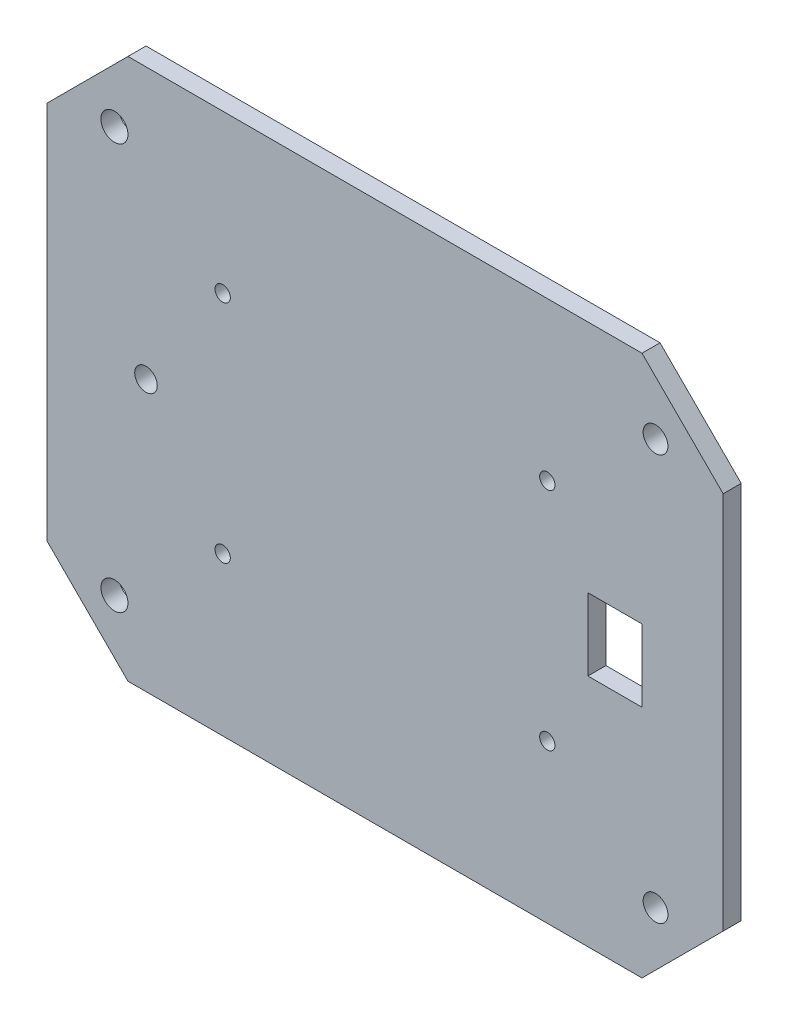
ISO-10303-21;
HEADER;
FILE_DESCRIPTION(('STEP AP214'),'2;1');
FILE_NAME('part.step','',(''),(''),'','','');
FILE_SCHEMA(('AUTOMOTIVE_DESIGN { 1 0 10303 214 1 1 1 1 }'));
ENDSEC;
DATA;
#1=APPLICATION_CONTEXT('core data for automotive mechanical design processes');
#2=APPLICATION_PROTOCOL_DEFINITION('international standard','automotive_design',2000,#1);
#3=PRODUCT_CONTEXT('',#1,'mechanical');
#4=PRODUCT('Part','Part','',(#3));
#5=PRODUCT_RELATED_PRODUCT_CATEGORY('part','',(#4));
#6=PRODUCT_DEFINITION_FORMATION('','',#4);
#7=PRODUCT_DEFINITION_CONTEXT('part definition',#1,'design');
#8=PRODUCT_DEFINITION('design','',#6,#7);
#9=PRODUCT_DEFINITION_SHAPE('','',#8);
#10=(LENGTH_UNIT() NAMED_UNIT(*) SI_UNIT(.MILLI.,.METRE.));
#11=(NAMED_UNIT(*) PLANE_ANGLE_UNIT() SI_UNIT($,.RADIAN.));
#12=(NAMED_UNIT(*) SI_UNIT($,.STERADIAN.) SOLID_ANGLE_UNIT());
#13=UNCERTAINTY_MEASURE_WITH_UNIT(LENGTH_MEASURE(1.E-05),#10,'distance_accuracy_value','');
#14=(GEOMETRIC_REPRESENTATION_CONTEXT(3) GLOBAL_UNCERTAINTY_ASSIGNED_CONTEXT((#13)) GLOBAL_UNIT_ASSIGNED_CONTEXT((#10,
#11,#12)) REPRESENTATION_CONTEXT('',''));
#15=CARTESIAN_POINT('',(0.,0.,0.));
#16=DIRECTION('',(0.,0.,1.));
#17=DIRECTION('',(1.,0.,0.));
#18=AXIS2_PLACEMENT_3D('',#15,#16,#17);
#19=CARTESIAN_POINT('',(0.,0.,4.));
#20=DIRECTION('',(0.,0.,1.));
#21=DIRECTION('',(1.,0.,0.));
#22=AXIS2_PLACEMENT_3D('',#19,#20,#21);
#23=PLANE('',#22);
#24=DIRECTION('',(1.,0.,0.));
#25=VECTOR('',#24,1.);
#26=CARTESIAN_POINT('',(45.,-8.,4.));
#27=LINE('',#26,#25);
#28=CARTESIAN_POINT('',(45.,-8.,4.));
#29=VERTEX_POINT('',#28);
#30=CARTESIAN_POINT('',(57.,-8.,4.));
#31=VERTEX_POINT('',#30);
#32=EDGE_CURVE('E138',#29,#31,#27,.T.);
#33=ORIENTED_EDGE('',*,*,#32,.F.);
#34=DIRECTION('',(0.,-1.,0.));
#35=VECTOR('',#34,1.);
#36=CARTESIAN_POINT('',(45.,-8.,4.));
#37=LINE('',#36,#35);
#38=CARTESIAN_POINT('',(45.,8.,4.));
#39=VERTEX_POINT('',#38);
#40=EDGE_CURVE('E130',#39,#29,#37,.T.);
#41=ORIENTED_EDGE('',*,*,#40,.F.);
#42=DIRECTION('',(-1.,0.,0.));
#43=VECTOR('',#42,1.);
#44=CARTESIAN_POINT('',(45.,8.,4.));
#45=LINE('',#44,#43);
#46=CARTESIAN_POINT('',(57.,8.,4.));
#47=VERTEX_POINT('',#46);
#48=EDGE_CURVE('E153',#47,#39,#45,.T.);
#49=ORIENTED_EDGE('',*,*,#48,.F.);
#50=DIRECTION('',(0.,1.,0.));
#51=VECTOR('',#50,1.);
#52=CARTESIAN_POINT('',(57.,-8.,4.));
#53=LINE('',#52,#51);
#54=EDGE_CURVE('E151',#31,#47,#53,.T.);
#55=ORIENTED_EDGE('',*,*,#54,.F.);
#56=EDGE_LOOP('',(#33,#41,#49,#55));
#57=FACE_BOUND('',#56,.T.);
#58=CARTESIAN_POINT('',(36.,25.,4.));
#59=DIRECTION('',(0.,0.,1.));
#60=DIRECTION('',(1.,0.,0.));
#61=AXIS2_PLACEMENT_3D('',#58,#59,#60);
#62=CIRCLE('',#61,1.7);
#63=CARTESIAN_POINT('',(37.7,25.,4.));
#64=VERTEX_POINT('',#63);
#65=EDGE_CURVE('E169',#64,#64,#62,.T.);
#66=ORIENTED_EDGE('',*,*,#65,.F.);
#67=EDGE_LOOP('',(#66));
#68=FACE_BOUND('',#67,.T.);
#69=CARTESIAN_POINT('',(-36.,25.,4.));
#70=DIRECTION('',(0.,0.,1.));
#71=DIRECTION('',(1.,0.,0.));
#72=AXIS2_PLACEMENT_3D('',#69,#70,#71);
#73=CIRCLE('',#72,1.7);
#74=CARTESIAN_POINT('',(-34.3,25.,4.));
#75=VERTEX_POINT('',#74);
#76=EDGE_CURVE('E181',#75,#75,#73,.T.);
#77=ORIENTED_EDGE('',*,*,#76,.F.);
#78=EDGE_LOOP('',(#77));
#79=FACE_BOUND('',#78,.T.);
#80=CARTESIAN_POINT('',(60.,45.,4.));
#81=DIRECTION('',(0.,0.,1.));
#82=DIRECTION('',(1.,0.,0.));
#83=AXIS2_PLACEMENT_3D('',#80,#81,#82);
#84=CIRCLE('',#83,2.75000000000001);
#85=CARTESIAN_POINT('',(62.75,45.,4.));
#86=VERTEX_POINT('',#85);
#87=EDGE_CURVE('E193',#86,#86,#84,.T.);
#88=ORIENTED_EDGE('',*,*,#87,.F.);
#89=EDGE_LOOP('',(#88));
#90=FACE_BOUND('',#89,.T.);
#91=CARTESIAN_POINT('',(-59.9999999999999,45.,4.));
#92=DIRECTION('',(0.,0.,1.));
#93=DIRECTION('',(1.,0.,0.));
#94=AXIS2_PLACEMENT_3D('',#91,#92,#93);
#95=CIRCLE('',#94,2.99999999999994);
#96=CARTESIAN_POINT('',(-57.,45.,4.));
#97=VERTEX_POINT('',#96);
#98=EDGE_CURVE('E205',#97,#97,#95,.T.);
#99=ORIENTED_EDGE('',*,*,#98,.F.);
#100=EDGE_LOOP('',(#99));
#101=FACE_BOUND('',#100,.T.);
#102=DIRECTION('',(0.707106781186544,-0.707106781186551,0.));
#103=VECTOR('',#102,1.);
#104=CARTESIAN_POINT('',(-74.9999999999999,-42.,4.));
#105=LINE('',#104,#103);
#106=CARTESIAN_POINT('',(-74.9999999999999,-42.,4.));
#107=VERTEX_POINT('',#106);
#108=CARTESIAN_POINT('',(-57.,-60.,4.));
#109=VERTEX_POINT('',#108);
#110=EDGE_CURVE('E217',#107,#109,#105,.T.);
#111=ORIENTED_EDGE('',*,*,#110,.T.);
#112=DIRECTION('',(1.,0.,0.));
#113=VECTOR('',#112,1.);
#114=CARTESIAN_POINT('',(-57.,-60.,4.));
#115=LINE('',#114,#113);
#116=CARTESIAN_POINT('',(57.,-60.,4.));
#117=VERTEX_POINT('',#116);
#118=EDGE_CURVE('E220',#109,#117,#115,.T.);
#119=ORIENTED_EDGE('',*,*,#118,.T.);
#120=DIRECTION('',(0.707106781186546,0.707106781186549,0.));
#121=VECTOR('',#120,1.);
#122=CARTESIAN_POINT('',(57.,-60.,4.));
#123=LINE('',#122,#121);
#124=CARTESIAN_POINT('',(75.,-42.,4.));
#125=VERTEX_POINT('',#124);
#126=EDGE_CURVE('E223',#117,#125,#123,.T.);
#127=ORIENTED_EDGE('',*,*,#126,.T.);
#128=DIRECTION('',(0.,1.,0.));
#129=VECTOR('',#128,1.);
#130=CARTESIAN_POINT('',(75.,-42.,4.));
#131=LINE('',#130,#129);
#132=CARTESIAN_POINT('',(75.,42.,4.));
#133=VERTEX_POINT('',#132);
#134=EDGE_CURVE('E225',#125,#133,#131,.T.);
#135=ORIENTED_EDGE('',*,*,#134,.T.);
#136=DIRECTION('',(-0.707106781186549,0.707106781186546,0.));
#137=VECTOR('',#136,1.);
#138=CARTESIAN_POINT('',(75.,42.,4.));
#139=LINE('',#138,#137);
#140=CARTESIAN_POINT('',(57.,59.9999999999999,4.));
#141=VERTEX_POINT('',#140);
#142=EDGE_CURVE('E227',#133,#141,#139,.T.);
#143=ORIENTED_EDGE('',*,*,#142,.T.);
#144=DIRECTION('',(-1.,0.,0.));
#145=VECTOR('',#144,1.);
#146=CARTESIAN_POINT('',(57.,59.9999999999999,4.));
#147=LINE('',#146,#145);
#148=CARTESIAN_POINT('',(-57.,59.9999999999999,4.));
#149=VERTEX_POINT('',#148);
#150=EDGE_CURVE('E229',#141,#149,#147,.T.);
#151=ORIENTED_EDGE('',*,*,#150,.T.);
#152=DIRECTION('',(-0.707106781186546,-0.707106781186548,0.));
#153=VECTOR('',#152,1.);
#154=CARTESIAN_POINT('',(-57.,59.9999999999999,4.));
#155=LINE('',#154,#153);
#156=CARTESIAN_POINT('',(-74.9999999999999,42.,4.));
#157=VERTEX_POINT('',#156);
#158=EDGE_CURVE('E231',#149,#157,#155,.T.);
#159=ORIENTED_EDGE('',*,*,#158,.T.);
#160=DIRECTION('',(0.,-1.,0.));
#161=VECTOR('',#160,1.);
#162=CARTESIAN_POINT('',(-74.9999999999999,42.,4.));
#163=LINE('',#162,#161);
#164=EDGE_CURVE('E233',#157,#107,#163,.T.);
#165=ORIENTED_EDGE('',*,*,#164,.T.);
#166=EDGE_LOOP('',(#111,#119,#127,#135,#143,#151,#159,#165));
#167=FACE_BOUND('',#166,.T.);
#168=CARTESIAN_POINT('',(-59.9999999999999,-45.0000000000001,4.));
#169=DIRECTION('',(0.,0.,1.));
#170=DIRECTION('',(1.,0.,0.));
#171=AXIS2_PLACEMENT_3D('',#168,#169,#170);
#172=CIRCLE('',#171,2.99999999999994);
#173=CARTESIAN_POINT('',(-57.,-45.0000000000001,4.));
#174=VERTEX_POINT('',#173);
#175=EDGE_CURVE('E211',#174,#174,#172,.T.);
#176=ORIENTED_EDGE('',*,*,#175,.F.);
#177=EDGE_LOOP('',(#176));
#178=FACE_BOUND('',#177,.T.);
#179=CARTESIAN_POINT('',(60.,-45.0000000000001,4.));
#180=DIRECTION('',(0.,0.,1.));
#181=DIRECTION('',(1.,0.,0.));
#182=AXIS2_PLACEMENT_3D('',#179,#180,#181);
#183=CIRCLE('',#182,2.75000000000001);
#184=CARTESIAN_POINT('',(62.75,-45.0000000000001,4.));
#185=VERTEX_POINT('',#184);
#186=EDGE_CURVE('E199',#185,#185,#183,.T.);
#187=ORIENTED_EDGE('',*,*,#186,.F.);
#188=EDGE_LOOP('',(#187));
#189=FACE_BOUND('',#188,.T.);
#190=CARTESIAN_POINT('',(-36.,-25.,4.));
#191=DIRECTION('',(0.,0.,1.));
#192=DIRECTION('',(1.,0.,0.));
#193=AXIS2_PLACEMENT_3D('',#190,#191,#192);
#194=CIRCLE('',#193,1.7);
#195=CARTESIAN_POINT('',(-34.3,-25.,4.));
#196=VERTEX_POINT('',#195);
#197=EDGE_CURVE('E187',#196,#196,#194,.T.);
#198=ORIENTED_EDGE('',*,*,#197,.F.);
#199=EDGE_LOOP('',(#198));
#200=FACE_BOUND('',#199,.T.);
#201=CARTESIAN_POINT('',(36.,-25.,4.));
#202=DIRECTION('',(0.,0.,1.));
#203=DIRECTION('',(1.,0.,0.));
#204=AXIS2_PLACEMENT_3D('',#201,#202,#203);
#205=CIRCLE('',#204,1.7);
#206=CARTESIAN_POINT('',(37.7,-25.,4.));
#207=VERTEX_POINT('',#206);
#208=EDGE_CURVE('E175',#207,#207,#205,.T.);
#209=ORIENTED_EDGE('',*,*,#208,.F.);
#210=EDGE_LOOP('',(#209));
#211=FACE_BOUND('',#210,.T.);
#212=CARTESIAN_POINT('',(-53.,0.,4.));
#213=DIRECTION('',(0.,0.,1.));
#214=DIRECTION('',(1.,0.,0.));
#215=AXIS2_PLACEMENT_3D('',#212,#213,#214);
#216=CIRCLE('',#215,2.5);
#217=CARTESIAN_POINT('',(-50.5,0.,4.));
#218=VERTEX_POINT('',#217);
#219=EDGE_CURVE('E159',#218,#218,#216,.T.);
#220=ORIENTED_EDGE('',*,*,#219,.F.);
#221=EDGE_LOOP('',(#220));
#222=FACE_BOUND('',#221,.T.);
#223=ADVANCED_FACE('F41',(#57,#68,#79,#90,#101,#167,#178,#189,#200,#211,#222),#23,.T.);
#224=CARTESIAN_POINT('',(0.,0.,0.));
#225=DIRECTION('',(0.,0.,1.));
#226=DIRECTION('',(1.,0.,0.));
#227=AXIS2_PLACEMENT_3D('',#224,#225,#226);
#228=PLANE('',#227);
#229=CARTESIAN_POINT('',(36.,25.,0.));
#230=DIRECTION('',(0.,0.,1.));
#231=DIRECTION('',(1.,0.,0.));
#232=AXIS2_PLACEMENT_3D('',#229,#230,#231);
#233=CIRCLE('',#232,1.7);
#234=CARTESIAN_POINT('',(37.7,25.,0.));
#235=VERTEX_POINT('',#234);
#236=EDGE_CURVE('E146',#235,#235,#233,.T.);
#237=ORIENTED_EDGE('',*,*,#236,.T.);
#238=EDGE_LOOP('',(#237));
#239=FACE_BOUND('',#238,.T.);
#240=CARTESIAN_POINT('',(36.,-25.,0.));
#241=DIRECTION('',(0.,0.,1.));
#242=DIRECTION('',(1.,0.,0.));
#243=AXIS2_PLACEMENT_3D('',#240,#241,#242);
#244=CIRCLE('',#243,1.7);
#245=CARTESIAN_POINT('',(37.7,-25.,0.));
#246=VERTEX_POINT('',#245);
#247=EDGE_CURVE('E172',#246,#246,#244,.T.);
#248=ORIENTED_EDGE('',*,*,#247,.T.);
#249=EDGE_LOOP('',(#248));
#250=FACE_BOUND('',#249,.T.);
#251=CARTESIAN_POINT('',(-36.,25.,0.));
#252=DIRECTION('',(0.,0.,1.));
#253=DIRECTION('',(1.,0.,0.));
#254=AXIS2_PLACEMENT_3D('',#251,#252,#253);
#255=CIRCLE('',#254,1.7);
#256=CARTESIAN_POINT('',(-34.3,25.,0.));
#257=VERTEX_POINT('',#256);
#258=EDGE_CURVE('E178',#257,#257,#255,.T.);
#259=ORIENTED_EDGE('',*,*,#258,.T.);
#260=EDGE_LOOP('',(#259));
#261=FACE_BOUND('',#260,.T.);
#262=CARTESIAN_POINT('',(-36.,-25.,0.));
#263=DIRECTION('',(0.,0.,1.));
#264=DIRECTION('',(1.,0.,0.));
#265=AXIS2_PLACEMENT_3D('',#262,#263,#264);
#266=CIRCLE('',#265,1.7);
#267=CARTESIAN_POINT('',(-34.3,-25.,0.));
#268=VERTEX_POINT('',#267);
#269=EDGE_CURVE('E184',#268,#268,#266,.T.);
#270=ORIENTED_EDGE('',*,*,#269,.T.);
#271=EDGE_LOOP('',(#270));
#272=FACE_BOUND('',#271,.T.);
#273=CARTESIAN_POINT('',(60.,45.,0.));
#274=DIRECTION('',(0.,0.,1.));
#275=DIRECTION('',(1.,0.,0.));
#276=AXIS2_PLACEMENT_3D('',#273,#274,#275);
#277=CIRCLE('',#276,2.75000000000001);
#278=CARTESIAN_POINT('',(62.75,45.,0.));
#279=VERTEX_POINT('',#278);
#280=EDGE_CURVE('E190',#279,#279,#277,.T.);
#281=ORIENTED_EDGE('',*,*,#280,.T.);
#282=EDGE_LOOP('',(#281));
#283=FACE_BOUND('',#282,.T.);
#284=CARTESIAN_POINT('',(60.,-45.0000000000001,0.));
#285=DIRECTION('',(0.,0.,1.));
#286=DIRECTION('',(1.,0.,0.));
#287=AXIS2_PLACEMENT_3D('',#284,#285,#286);
#288=CIRCLE('',#287,2.75000000000001);
#289=CARTESIAN_POINT('',(62.75,-45.0000000000001,0.));
#290=VERTEX_POINT('',#289);
#291=EDGE_CURVE('E196',#290,#290,#288,.T.);
#292=ORIENTED_EDGE('',*,*,#291,.T.);
#293=EDGE_LOOP('',(#292));
#294=FACE_BOUND('',#293,.T.);
#295=CARTESIAN_POINT('',(-59.9999999999999,45.,0.));
#296=DIRECTION('',(0.,0.,1.));
#297=DIRECTION('',(1.,0.,0.));
#298=AXIS2_PLACEMENT_3D('',#295,#296,#297);
#299=CIRCLE('',#298,2.99999999999994);
#300=CARTESIAN_POINT('',(-57.,45.,0.));
#301=VERTEX_POINT('',#300);
#302=EDGE_CURVE('E202',#301,#301,#299,.T.);
#303=ORIENTED_EDGE('',*,*,#302,.T.);
#304=EDGE_LOOP('',(#303));
#305=FACE_BOUND('',#304,.T.);
#306=CARTESIAN_POINT('',(-59.9999999999999,-45.0000000000001,0.));
#307=DIRECTION('',(0.,0.,1.));
#308=DIRECTION('',(1.,0.,0.));
#309=AXIS2_PLACEMENT_3D('',#306,#307,#308);
#310=CIRCLE('',#309,2.99999999999994);
#311=CARTESIAN_POINT('',(-57.,-45.0000000000001,0.));
#312=VERTEX_POINT('',#311);
#313=EDGE_CURVE('E208',#312,#312,#310,.T.);
#314=ORIENTED_EDGE('',*,*,#313,.T.);
#315=EDGE_LOOP('',(#314));
#316=FACE_BOUND('',#315,.T.);
#317=DIRECTION('',(0.707106781186544,-0.707106781186551,0.));
#318=VECTOR('',#317,1.);
#319=CARTESIAN_POINT('',(-74.9999999999999,-42.,0.));
#320=LINE('',#319,#318);
#321=CARTESIAN_POINT('',(-74.9999999999999,-42.,0.));
#322=VERTEX_POINT('',#321);
#323=CARTESIAN_POINT('',(-57.,-60.,0.));
#324=VERTEX_POINT('',#323);
#325=EDGE_CURVE('E214',#322,#324,#320,.T.);
#326=ORIENTED_EDGE('',*,*,#325,.F.);
#327=DIRECTION('',(0.,-1.,0.));
#328=VECTOR('',#327,1.);
#329=CARTESIAN_POINT('',(-74.9999999999999,42.,0.));
#330=LINE('',#329,#328);
#331=CARTESIAN_POINT('',(-74.9999999999999,42.,0.));
#332=VERTEX_POINT('',#331);
#333=EDGE_CURVE('E221',#332,#322,#330,.T.);
#334=ORIENTED_EDGE('',*,*,#333,.F.);
#335=DIRECTION('',(-0.707106781186546,-0.707106781186548,0.));
#336=VECTOR('',#335,1.);
#337=CARTESIAN_POINT('',(-57.,59.9999999999999,0.));
#338=LINE('',#337,#336);
#339=CARTESIAN_POINT('',(-57.,59.9999999999999,0.));
#340=VERTEX_POINT('',#339);
#341=EDGE_CURVE('E248',#340,#332,#338,.T.);
#342=ORIENTED_EDGE('',*,*,#341,.F.);
#343=DIRECTION('',(-1.,0.,0.));
#344=VECTOR('',#343,1.);
#345=CARTESIAN_POINT('',(57.,59.9999999999999,0.));
#346=LINE('',#345,#344);
#347=CARTESIAN_POINT('',(57.,59.9999999999999,0.));
#348=VERTEX_POINT('',#347);
#349=EDGE_CURVE('E246',#348,#340,#346,.T.);
#350=ORIENTED_EDGE('',*,*,#349,.F.);
#351=DIRECTION('',(-0.707106781186549,0.707106781186546,0.));
#352=VECTOR('',#351,1.);
#353=CARTESIAN_POINT('',(75.,42.,0.));
#354=LINE('',#353,#352);
#355=CARTESIAN_POINT('',(75.,42.,0.));
#356=VERTEX_POINT('',#355);
#357=EDGE_CURVE('E244',#356,#348,#354,.T.);
#358=ORIENTED_EDGE('',*,*,#357,.F.);
#359=DIRECTION('',(0.,1.,0.));
#360=VECTOR('',#359,1.);
#361=CARTESIAN_POINT('',(75.,-42.,0.));
#362=LINE('',#361,#360);
#363=CARTESIAN_POINT('',(75.,-42.,0.));
#364=VERTEX_POINT('',#363);
#365=EDGE_CURVE('E242',#364,#356,#362,.T.);
#366=ORIENTED_EDGE('',*,*,#365,.F.);
#367=DIRECTION('',(0.707106781186546,0.707106781186549,0.));
#368=VECTOR('',#367,1.);
#369=CARTESIAN_POINT('',(57.,-60.,0.));
#370=LINE('',#369,#368);
#371=CARTESIAN_POINT('',(57.,-60.,0.));
#372=VERTEX_POINT('',#371);
#373=EDGE_CURVE('E240',#372,#364,#370,.T.);
#374=ORIENTED_EDGE('',*,*,#373,.F.);
#375=DIRECTION('',(1.,0.,0.));
#376=VECTOR('',#375,1.);
#377=CARTESIAN_POINT('',(-57.,-60.,0.));
#378=LINE('',#377,#376);
#379=EDGE_CURVE('E238',#324,#372,#378,.T.);
#380=ORIENTED_EDGE('',*,*,#379,.F.);
#381=EDGE_LOOP('',(#326,#334,#342,#350,#358,#366,#374,#380));
#382=FACE_BOUND('',#381,.T.);
#383=DIRECTION('',(0.,-1.,0.));
#384=VECTOR('',#383,1.);
#385=CARTESIAN_POINT('',(45.,-8.,0.));
#386=LINE('',#385,#384);
#387=CARTESIAN_POINT('',(45.,8.,0.));
#388=VERTEX_POINT('',#387);
#389=CARTESIAN_POINT('',(45.,-8.,0.));
#390=VERTEX_POINT('',#389);
#391=EDGE_CURVE('E64',#388,#390,#386,.T.);
#392=ORIENTED_EDGE('',*,*,#391,.T.);
#393=DIRECTION('',(1.,0.,0.));
#394=VECTOR('',#393,1.);
#395=CARTESIAN_POINT('',(45.,-8.,0.));
#396=LINE('',#395,#394);
#397=CARTESIAN_POINT('',(57.,-8.,0.));
#398=VERTEX_POINT('',#397);
#399=EDGE_CURVE('E145',#390,#398,#396,.T.);
#400=ORIENTED_EDGE('',*,*,#399,.T.);
#401=DIRECTION('',(0.,1.,0.));
#402=VECTOR('',#401,1.);
#403=CARTESIAN_POINT('',(57.,-8.,0.));
#404=LINE('',#403,#402);
#405=CARTESIAN_POINT('',(57.,8.,0.));
#406=VERTEX_POINT('',#405);
#407=EDGE_CURVE('E161',#398,#406,#404,.T.);
#408=ORIENTED_EDGE('',*,*,#407,.T.);
#409=DIRECTION('',(-1.,0.,0.));
#410=VECTOR('',#409,1.);
#411=CARTESIAN_POINT('',(45.,8.,0.));
#412=LINE('',#411,#410);
#413=EDGE_CURVE('E139',#406,#388,#412,.T.);
#414=ORIENTED_EDGE('',*,*,#413,.T.);
#415=EDGE_LOOP('',(#392,#400,#408,#414));
#416=FACE_BOUND('',#415,.T.);
#417=CARTESIAN_POINT('',(-53.,0.,0.));
#418=DIRECTION('',(0.,0.,1.));
#419=DIRECTION('',(1.,0.,0.));
#420=AXIS2_PLACEMENT_3D('',#417,#418,#419);
#421=CIRCLE('',#420,2.5);
#422=CARTESIAN_POINT('',(-50.5,0.,0.));
#423=VERTEX_POINT('',#422);
#424=EDGE_CURVE('E354',#423,#423,#421,.T.);
#425=ORIENTED_EDGE('',*,*,#424,.T.);
#426=EDGE_LOOP('',(#425));
#427=FACE_BOUND('',#426,.T.);
#428=ADVANCED_FACE('F278',(#239,#250,#261,#272,#283,#294,#305,#316,#382,#416,#427),#228,.F.);
#429=CARTESIAN_POINT('',(-74.9999999999999,-42.,4.));
#430=DIRECTION('',(0.707106781186551,0.707106781186544,0.));
#431=DIRECTION('',(-0.707106781186544,0.707106781186551,0.));
#432=AXIS2_PLACEMENT_3D('',#429,#430,#431);
#433=PLANE('',#432);
#434=ORIENTED_EDGE('',*,*,#325,.T.);
#435=DIRECTION('',(0.,0.,-1.));
#436=VECTOR('',#435,1.);
#437=CARTESIAN_POINT('',(-57.,-60.,4.));
#438=LINE('',#437,#436);
#439=EDGE_CURVE('E11',#109,#324,#438,.T.);
#440=ORIENTED_EDGE('',*,*,#439,.F.);
#441=ORIENTED_EDGE('',*,*,#110,.F.);
#442=DIRECTION('',(0.,0.,-1.));
#443=VECTOR('',#442,1.);
#444=CARTESIAN_POINT('',(-74.9999999999999,-42.,4.));
#445=LINE('',#444,#443);
#446=EDGE_CURVE('E235',#107,#322,#445,.T.);
#447=ORIENTED_EDGE('',*,*,#446,.T.);
#448=EDGE_LOOP('',(#434,#440,#441,#447));
#449=FACE_BOUND('',#448,.T.);
#450=ADVANCED_FACE('F43',(#449),#433,.F.);
#451=CARTESIAN_POINT('',(-57.,-60.,4.));
#452=DIRECTION('',(0.,1.,0.));
#453=DIRECTION('',(0.,0.,1.));
#454=AXIS2_PLACEMENT_3D('',#451,#452,#453);
#455=PLANE('',#454);
#456=ORIENTED_EDGE('',*,*,#379,.T.);
#457=DIRECTION('',(0.,0.,-1.));
#458=VECTOR('',#457,1.);
#459=CARTESIAN_POINT('',(57.,-60.,4.));
#460=LINE('',#459,#458);
#461=EDGE_CURVE('E49',#117,#372,#460,.T.);
#462=ORIENTED_EDGE('',*,*,#461,.F.);
#463=ORIENTED_EDGE('',*,*,#118,.F.);
#464=ORIENTED_EDGE('',*,*,#439,.T.);
#465=EDGE_LOOP('',(#456,#462,#463,#464));
#466=FACE_BOUND('',#465,.T.);
#467=ADVANCED_FACE('F296',(#466),#455,.F.);
#468=CARTESIAN_POINT('',(57.,-60.,4.));
#469=DIRECTION('',(-0.707106781186549,0.707106781186546,0.));
#470=DIRECTION('',(-0.707106781186546,-0.707106781186549,0.));
#471=AXIS2_PLACEMENT_3D('',#468,#469,#470);
#472=PLANE('',#471);
#473=ORIENTED_EDGE('',*,*,#373,.T.);
#474=DIRECTION('',(0.,0.,-1.));
#475=VECTOR('',#474,1.);
#476=CARTESIAN_POINT('',(75.,-42.,4.));
#477=LINE('',#476,#475);
#478=EDGE_CURVE('E265',#125,#364,#477,.T.);
#479=ORIENTED_EDGE('',*,*,#478,.F.);
#480=ORIENTED_EDGE('',*,*,#126,.F.);
#481=ORIENTED_EDGE('',*,*,#461,.T.);
#482=EDGE_LOOP('',(#473,#479,#480,#481));
#483=FACE_BOUND('',#482,.T.);
#484=ADVANCED_FACE('F272',(#483),#472,.F.);
#485=CARTESIAN_POINT('',(75.,-42.,4.));
#486=DIRECTION('',(-1.,0.,0.));
#487=DIRECTION('',(0.,0.,1.));
#488=AXIS2_PLACEMENT_3D('',#485,#486,#487);
#489=PLANE('',#488);
#490=ORIENTED_EDGE('',*,*,#365,.T.);
#491=DIRECTION('',(0.,0.,-1.));
#492=VECTOR('',#491,1.);
#493=CARTESIAN_POINT('',(75.,42.,4.));
#494=LINE('',#493,#492);
#495=EDGE_CURVE('E262',#133,#356,#494,.T.);
#496=ORIENTED_EDGE('',*,*,#495,.F.);
#497=ORIENTED_EDGE('',*,*,#134,.F.);
#498=ORIENTED_EDGE('',*,*,#478,.T.);
#499=EDGE_LOOP('',(#490,#496,#497,#498));
#500=FACE_BOUND('',#499,.T.);
#501=ADVANCED_FACE('F284',(#500),#489,.F.);
#502=CARTESIAN_POINT('',(75.,42.,4.));
#503=DIRECTION('',(-0.707106781186546,-0.707106781186549,0.));
#504=DIRECTION('',(0.707106781186549,-0.707106781186546,0.));
#505=AXIS2_PLACEMENT_3D('',#502,#503,#504);
#506=PLANE('',#505);
#507=ORIENTED_EDGE('',*,*,#357,.T.);
#508=DIRECTION('',(0.,0.,-1.));
#509=VECTOR('',#508,1.);
#510=CARTESIAN_POINT('',(57.,59.9999999999999,4.));
#511=LINE('',#510,#509);
#512=EDGE_CURVE('E259',#141,#348,#511,.T.);
#513=ORIENTED_EDGE('',*,*,#512,.F.);
#514=ORIENTED_EDGE('',*,*,#142,.F.);
#515=ORIENTED_EDGE('',*,*,#495,.T.);
#516=EDGE_LOOP('',(#507,#513,#514,#515));
#517=FACE_BOUND('',#516,.T.);
#518=ADVANCED_FACE('F288',(#517),#506,.F.);
#519=CARTESIAN_POINT('',(57.,59.9999999999999,4.));
#520=DIRECTION('',(0.,-1.,0.));
#521=DIRECTION('',(0.,0.,-1.));
#522=AXIS2_PLACEMENT_3D('',#519,#520,#521);
#523=PLANE('',#522);
#524=ORIENTED_EDGE('',*,*,#349,.T.);
#525=DIRECTION('',(0.,0.,-1.));
#526=VECTOR('',#525,1.);
#527=CARTESIAN_POINT('',(-57.,59.9999999999999,4.));
#528=LINE('',#527,#526);
#529=EDGE_CURVE('E256',#149,#340,#528,.T.);
#530=ORIENTED_EDGE('',*,*,#529,.F.);
#531=ORIENTED_EDGE('',*,*,#150,.F.);
#532=ORIENTED_EDGE('',*,*,#512,.T.);
#533=EDGE_LOOP('',(#524,#530,#531,#532));
#534=FACE_BOUND('',#533,.T.);
#535=ADVANCED_FACE('F309',(#534),#523,.F.);
#536=CARTESIAN_POINT('',(-57.,59.9999999999999,4.));
#537=DIRECTION('',(0.707106781186549,-0.707106781186547,0.));
#538=DIRECTION('',(0.707106781186546,0.707106781186549,0.));
#539=AXIS2_PLACEMENT_3D('',#536,#537,#538);
#540=PLANE('',#539);
#541=ORIENTED_EDGE('',*,*,#341,.T.);
#542=DIRECTION('',(0.,0.,-1.));
#543=VECTOR('',#542,1.);
#544=CARTESIAN_POINT('',(-74.9999999999999,42.,4.));
#545=LINE('',#544,#543);
#546=EDGE_CURVE('E253',#157,#332,#545,.T.);
#547=ORIENTED_EDGE('',*,*,#546,.F.);
#548=ORIENTED_EDGE('',*,*,#158,.F.);
#549=ORIENTED_EDGE('',*,*,#529,.T.);
#550=EDGE_LOOP('',(#541,#547,#548,#549));
#551=FACE_BOUND('',#550,.T.);
#552=ADVANCED_FACE('F307',(#551),#540,.F.);
#553=CARTESIAN_POINT('',(-74.9999999999999,42.,4.));
#554=DIRECTION('',(1.,0.,0.));
#555=DIRECTION('',(0.,0.,-1.));
#556=AXIS2_PLACEMENT_3D('',#553,#554,#555);
#557=PLANE('',#556);
#558=ORIENTED_EDGE('',*,*,#333,.T.);
#559=ORIENTED_EDGE('',*,*,#446,.F.);
#560=ORIENTED_EDGE('',*,*,#164,.F.);
#561=ORIENTED_EDGE('',*,*,#546,.T.);
#562=EDGE_LOOP('',(#558,#559,#560,#561));
#563=FACE_BOUND('',#562,.T.);
#564=ADVANCED_FACE('F302',(#563),#557,.F.);
#565=CARTESIAN_POINT('',(-59.9999999999999,-45.0000000000001,4.));
#566=DIRECTION('',(0.,0.,-1.));
#567=DIRECTION('',(-1.,0.,0.));
#568=AXIS2_PLACEMENT_3D('',#565,#566,#567);
#569=CYLINDRICAL_SURFACE('',#568,2.99999999999994);
#570=ORIENTED_EDGE('',*,*,#175,.T.);
#571=EDGE_LOOP('',(#570));
#572=FACE_BOUND('',#571,.T.);
#573=ORIENTED_EDGE('',*,*,#313,.F.);
#574=EDGE_LOOP('',(#573));
#575=FACE_BOUND('',#574,.T.);
#576=ADVANCED_FACE('F326',(#572,#575),#569,.F.);
#577=CARTESIAN_POINT('',(-59.9999999999999,45.,4.));
#578=DIRECTION('',(0.,0.,-1.));
#579=DIRECTION('',(-1.,0.,0.));
#580=AXIS2_PLACEMENT_3D('',#577,#578,#579);
#581=CYLINDRICAL_SURFACE('',#580,2.99999999999994);
#582=ORIENTED_EDGE('',*,*,#98,.T.);
#583=EDGE_LOOP('',(#582));
#584=FACE_BOUND('',#583,.T.);
#585=ORIENTED_EDGE('',*,*,#302,.F.);
#586=EDGE_LOOP('',(#585));
#587=FACE_BOUND('',#586,.T.);
#588=ADVANCED_FACE('F333',(#584,#587),#581,.F.);
#589=CARTESIAN_POINT('',(60.,-45.0000000000001,4.));
#590=DIRECTION('',(0.,0.,-1.));
#591=DIRECTION('',(-1.,0.,0.));
#592=AXIS2_PLACEMENT_3D('',#589,#590,#591);
#593=CYLINDRICAL_SURFACE('',#592,2.75000000000001);
#594=ORIENTED_EDGE('',*,*,#186,.T.);
#595=EDGE_LOOP('',(#594));
#596=FACE_BOUND('',#595,.T.);
#597=ORIENTED_EDGE('',*,*,#291,.F.);
#598=EDGE_LOOP('',(#597));
#599=FACE_BOUND('',#598,.T.);
#600=ADVANCED_FACE('F338',(#596,#599),#593,.F.);
#601=CARTESIAN_POINT('',(60.,45.,4.));
#602=DIRECTION('',(0.,0.,-1.));
#603=DIRECTION('',(-1.,0.,0.));
#604=AXIS2_PLACEMENT_3D('',#601,#602,#603);
#605=CYLINDRICAL_SURFACE('',#604,2.75000000000001);
#606=ORIENTED_EDGE('',*,*,#87,.T.);
#607=EDGE_LOOP('',(#606));
#608=FACE_BOUND('',#607,.T.);
#609=ORIENTED_EDGE('',*,*,#280,.F.);
#610=EDGE_LOOP('',(#609));
#611=FACE_BOUND('',#610,.T.);
#612=ADVANCED_FACE('F392',(#608,#611),#605,.F.);
#613=CARTESIAN_POINT('',(-36.,-25.,4.));
#614=DIRECTION('',(0.,0.,-1.));
#615=DIRECTION('',(-1.,0.,0.));
#616=AXIS2_PLACEMENT_3D('',#613,#614,#615);
#617=CYLINDRICAL_SURFACE('',#616,1.7);
#618=ORIENTED_EDGE('',*,*,#197,.T.);
#619=EDGE_LOOP('',(#618));
#620=FACE_BOUND('',#619,.T.);
#621=ORIENTED_EDGE('',*,*,#269,.F.);
#622=EDGE_LOOP('',(#621));
#623=FACE_BOUND('',#622,.T.);
#624=ADVANCED_FACE('F388',(#620,#623),#617,.F.);
#625=CARTESIAN_POINT('',(-36.,25.,4.));
#626=DIRECTION('',(0.,0.,-1.));
#627=DIRECTION('',(-1.,0.,0.));
#628=AXIS2_PLACEMENT_3D('',#625,#626,#627);
#629=CYLINDRICAL_SURFACE('',#628,1.7);
#630=ORIENTED_EDGE('',*,*,#76,.T.);
#631=EDGE_LOOP('',(#630));
#632=FACE_BOUND('',#631,.T.);
#633=ORIENTED_EDGE('',*,*,#258,.F.);
#634=EDGE_LOOP('',(#633));
#635=FACE_BOUND('',#634,.T.);
#636=ADVANCED_FACE('F384',(#632,#635),#629,.F.);
#637=CARTESIAN_POINT('',(36.,-25.,4.));
#638=DIRECTION('',(0.,0.,-1.));
#639=DIRECTION('',(-1.,0.,0.));
#640=AXIS2_PLACEMENT_3D('',#637,#638,#639);
#641=CYLINDRICAL_SURFACE('',#640,1.7);
#642=ORIENTED_EDGE('',*,*,#208,.T.);
#643=EDGE_LOOP('',(#642));
#644=FACE_BOUND('',#643,.T.);
#645=ORIENTED_EDGE('',*,*,#247,.F.);
#646=EDGE_LOOP('',(#645));
#647=FACE_BOUND('',#646,.T.);
#648=ADVANCED_FACE('F380',(#644,#647),#641,.F.);
#649=CARTESIAN_POINT('',(36.,25.,4.));
#650=DIRECTION('',(0.,0.,-1.));
#651=DIRECTION('',(-1.,0.,0.));
#652=AXIS2_PLACEMENT_3D('',#649,#650,#651);
#653=CYLINDRICAL_SURFACE('',#652,1.7);
#654=ORIENTED_EDGE('',*,*,#65,.T.);
#655=EDGE_LOOP('',(#654));
#656=FACE_BOUND('',#655,.T.);
#657=ORIENTED_EDGE('',*,*,#236,.F.);
#658=EDGE_LOOP('',(#657));
#659=FACE_BOUND('',#658,.T.);
#660=ADVANCED_FACE('F377',(#656,#659),#653,.F.);
#661=CARTESIAN_POINT('',(45.,-8.,4.));
#662=DIRECTION('',(1.,0.,0.));
#663=DIRECTION('',(0.,0.,-1.));
#664=AXIS2_PLACEMENT_3D('',#661,#662,#663);
#665=PLANE('',#664);
#666=ORIENTED_EDGE('',*,*,#391,.F.);
#667=DIRECTION('',(0.,0.,-1.));
#668=VECTOR('',#667,1.);
#669=CARTESIAN_POINT('',(45.,8.,4.));
#670=LINE('',#669,#668);
#671=EDGE_CURVE('E134',#39,#388,#670,.T.);
#672=ORIENTED_EDGE('',*,*,#671,.F.);
#673=ORIENTED_EDGE('',*,*,#40,.T.);
#674=DIRECTION('',(0.,0.,-1.));
#675=VECTOR('',#674,1.);
#676=CARTESIAN_POINT('',(45.,-8.,4.));
#677=LINE('',#676,#675);
#678=EDGE_CURVE('E133',#29,#390,#677,.T.);
#679=ORIENTED_EDGE('',*,*,#678,.T.);
#680=EDGE_LOOP('',(#666,#672,#673,#679));
#681=FACE_BOUND('',#680,.T.);
#682=ADVANCED_FACE('F132',(#681),#665,.T.);
#683=CARTESIAN_POINT('',(45.,-8.,4.));
#684=DIRECTION('',(0.,1.,0.));
#685=DIRECTION('',(0.,0.,1.));
#686=AXIS2_PLACEMENT_3D('',#683,#684,#685);
#687=PLANE('',#686);
#688=ORIENTED_EDGE('',*,*,#399,.F.);
#689=ORIENTED_EDGE('',*,*,#678,.F.);
#690=ORIENTED_EDGE('',*,*,#32,.T.);
#691=DIRECTION('',(0.,0.,-1.));
#692=VECTOR('',#691,1.);
#693=CARTESIAN_POINT('',(57.,-8.,4.));
#694=LINE('',#693,#692);
#695=EDGE_CURVE('E147',#31,#398,#694,.T.);
#696=ORIENTED_EDGE('',*,*,#695,.T.);
#697=EDGE_LOOP('',(#688,#689,#690,#696));
#698=FACE_BOUND('',#697,.T.);
#699=ADVANCED_FACE('F142',(#698),#687,.T.);
#700=CARTESIAN_POINT('',(57.,-8.,4.));
#701=DIRECTION('',(-1.,0.,0.));
#702=DIRECTION('',(0.,0.,1.));
#703=AXIS2_PLACEMENT_3D('',#700,#701,#702);
#704=PLANE('',#703);
#705=ORIENTED_EDGE('',*,*,#407,.F.);
#706=ORIENTED_EDGE('',*,*,#695,.F.);
#707=ORIENTED_EDGE('',*,*,#54,.T.);
#708=DIRECTION('',(0.,0.,-1.));
#709=VECTOR('',#708,1.);
#710=CARTESIAN_POINT('',(57.,8.,4.));
#711=LINE('',#710,#709);
#712=EDGE_CURVE('E56',#47,#406,#711,.T.);
#713=ORIENTED_EDGE('',*,*,#712,.T.);
#714=EDGE_LOOP('',(#705,#706,#707,#713));
#715=FACE_BOUND('',#714,.T.);
#716=ADVANCED_FACE('F367',(#715),#704,.T.);
#717=CARTESIAN_POINT('',(45.,8.,4.));
#718=DIRECTION('',(0.,-1.,0.));
#719=DIRECTION('',(0.,0.,-1.));
#720=AXIS2_PLACEMENT_3D('',#717,#718,#719);
#721=PLANE('',#720);
#722=ORIENTED_EDGE('',*,*,#413,.F.);
#723=ORIENTED_EDGE('',*,*,#712,.F.);
#724=ORIENTED_EDGE('',*,*,#48,.T.);
#725=ORIENTED_EDGE('',*,*,#671,.T.);
#726=EDGE_LOOP('',(#722,#723,#724,#725));
#727=FACE_BOUND('',#726,.T.);
#728=ADVANCED_FACE('F362',(#727),#721,.T.);
#729=CARTESIAN_POINT('',(-53.,0.,4.));
#730=DIRECTION('',(0.,0.,-1.));
#731=DIRECTION('',(-1.,0.,0.));
#732=AXIS2_PLACEMENT_3D('',#729,#730,#731);
#733=CYLINDRICAL_SURFACE('',#732,2.5);
#734=ORIENTED_EDGE('',*,*,#219,.T.);
#735=EDGE_LOOP('',(#734));
#736=FACE_BOUND('',#735,.T.);
#737=ORIENTED_EDGE('',*,*,#424,.F.);
#738=EDGE_LOOP('',(#737));
#739=FACE_BOUND('',#738,.T.);
#740=ADVANCED_FACE('F360',(#736,#739),#733,.F.);
#741=CLOSED_SHELL('',(#223,#428,#450,#467,#484,#501,#518,#535,#552,#564,#576,#588,#600,#612,
#624,#636,#648,#660,#682,#699,#716,#728,#740));
#742=MANIFOLD_SOLID_BREP('B2',#741);
#743=ADVANCED_BREP_SHAPE_REPRESENTATION('',(#18,#742),#14);
#744=SHAPE_DEFINITION_REPRESENTATION(#9,#743);
ENDSEC;
END-ISO-10303-21;
